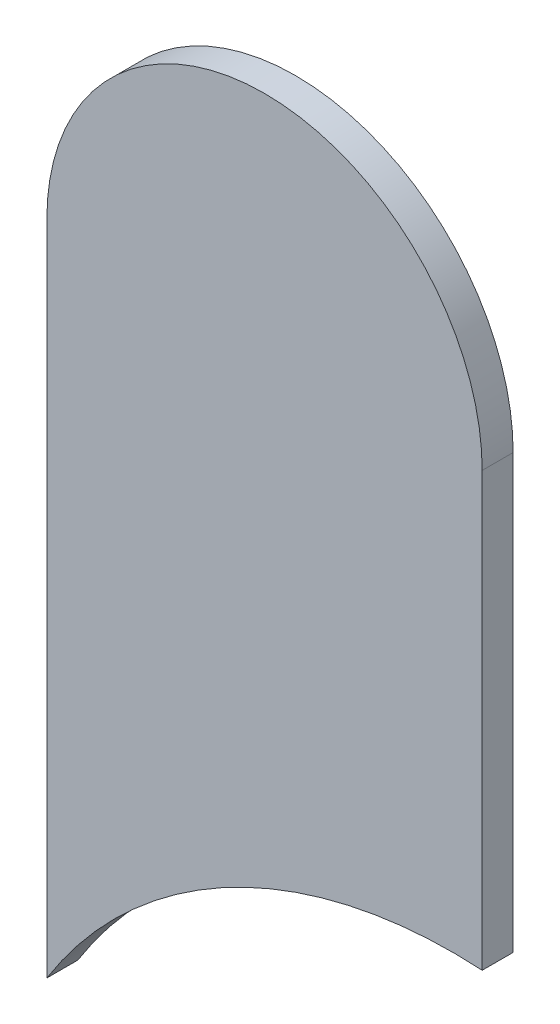
ISO-10303-21;
HEADER;
FILE_DESCRIPTION(('STEP AP214'),'2;1');
FILE_NAME('part.step','',(''),(''),'','','');
FILE_SCHEMA(('AUTOMOTIVE_DESIGN { 1 0 10303 214 1 1 1 1 }'));
ENDSEC;
DATA;
#1=APPLICATION_CONTEXT('core data for automotive mechanical design processes');
#2=APPLICATION_PROTOCOL_DEFINITION('international standard','automotive_design',2000,#1);
#3=PRODUCT_CONTEXT('',#1,'mechanical');
#4=PRODUCT('Part','Part','',(#3));
#5=PRODUCT_RELATED_PRODUCT_CATEGORY('part','',(#4));
#6=PRODUCT_DEFINITION_FORMATION('','',#4);
#7=PRODUCT_DEFINITION_CONTEXT('part definition',#1,'design');
#8=PRODUCT_DEFINITION('design','',#6,#7);
#9=PRODUCT_DEFINITION_SHAPE('','',#8);
#10=(LENGTH_UNIT() NAMED_UNIT(*) SI_UNIT(.MILLI.,.METRE.));
#11=(NAMED_UNIT(*) PLANE_ANGLE_UNIT() SI_UNIT($,.RADIAN.));
#12=(NAMED_UNIT(*) SI_UNIT($,.STERADIAN.) SOLID_ANGLE_UNIT());
#13=UNCERTAINTY_MEASURE_WITH_UNIT(LENGTH_MEASURE(1.E-05),#10,'distance_accuracy_value','');
#14=(GEOMETRIC_REPRESENTATION_CONTEXT(3) GLOBAL_UNCERTAINTY_ASSIGNED_CONTEXT((#13)) GLOBAL_UNIT_ASSIGNED_CONTEXT((#10,
#11,#12)) REPRESENTATION_CONTEXT('',''));
#15=CARTESIAN_POINT('',(0.,0.,0.));
#16=DIRECTION('',(0.,0.,1.));
#17=DIRECTION('',(1.,0.,0.));
#18=AXIS2_PLACEMENT_3D('',#15,#16,#17);
#19=CARTESIAN_POINT('',(78.9335099,66.7856251389162,0.));
#20=DIRECTION('',(-1.,0.,0.));
#21=DIRECTION('',(0.,1.,0.));
#22=AXIS2_PLACEMENT_3D('',#19,#20,#21);
#23=PLANE('',#22);
#24=DIRECTION('',(0.,1.,0.));
#25=VECTOR('',#24,1.);
#26=CARTESIAN_POINT('',(78.9335099,66.4532072,0.03556));
#27=LINE('',#26,#25);
#28=CARTESIAN_POINT('',(78.9335099,66.7856251389162,0.03556));
#29=VERTEX_POINT('',#28);
#30=CARTESIAN_POINT('',(78.9335099,67.2828728,0.03556));
#31=VERTEX_POINT('',#30);
#32=EDGE_CURVE('E11',#29,#31,#27,.T.);
#33=ORIENTED_EDGE('',*,*,#32,.F.);
#34=DIRECTION('',(0.,0.,1.));
#35=VECTOR('',#34,1.);
#36=CARTESIAN_POINT('',(78.9335099,66.7856251389162,0.));
#37=LINE('',#36,#35);
#38=CARTESIAN_POINT('',(78.9335099,66.7856251389162,0.));
#39=VERTEX_POINT('',#38);
#40=EDGE_CURVE('E24',#39,#29,#37,.T.);
#41=ORIENTED_EDGE('',*,*,#40,.F.);
#42=DIRECTION('',(0.,1.,0.));
#43=VECTOR('',#42,1.);
#44=CARTESIAN_POINT('',(78.9335099,66.4532072,0.));
#45=LINE('',#44,#43);
#46=CARTESIAN_POINT('',(78.9335099,67.2828728,0.));
#47=VERTEX_POINT('',#46);
#48=EDGE_CURVE('E75',#39,#47,#45,.T.);
#49=ORIENTED_EDGE('',*,*,#48,.T.);
#50=DIRECTION('',(0.,0.,1.));
#51=VECTOR('',#50,1.);
#52=CARTESIAN_POINT('',(78.9335099,67.2828728,0.));
#53=LINE('',#52,#51);
#54=EDGE_CURVE('E37',#47,#31,#53,.T.);
#55=ORIENTED_EDGE('',*,*,#54,.T.);
#56=EDGE_LOOP('',(#33,#41,#49,#55));
#57=FACE_BOUND('',#56,.T.);
#58=ADVANCED_FACE('F17',(#57),#23,.F.);
#59=CARTESIAN_POINT('',(78.6835104,67.2828728,0.));
#60=DIRECTION('',(0.,0.,-1.));
#61=DIRECTION('',(1.,0.,0.));
#62=AXIS2_PLACEMENT_3D('',#59,#60,#61);
#63=CYLINDRICAL_SURFACE('',#62,0.249999500000001);
#64=CARTESIAN_POINT('',(78.6835104,67.2828728,0.03556));
#65=DIRECTION('',(0.,0.,1.));
#66=DIRECTION('',(1.,0.,0.));
#67=AXIS2_PLACEMENT_3D('',#64,#65,#66);
#68=CIRCLE('',#67,0.249999500000001);
#69=CARTESIAN_POINT('',(78.4335109,67.2828728,0.03556));
#70=VERTEX_POINT('',#69);
#71=EDGE_CURVE('E83',#31,#70,#68,.T.);
#72=ORIENTED_EDGE('',*,*,#71,.F.);
#73=ORIENTED_EDGE('',*,*,#54,.F.);
#74=CARTESIAN_POINT('',(78.6835104,67.2828728,0.));
#75=DIRECTION('',(0.,0.,1.));
#76=DIRECTION('',(1.,0.,0.));
#77=AXIS2_PLACEMENT_3D('',#74,#75,#76);
#78=CIRCLE('',#77,0.249999500000001);
#79=CARTESIAN_POINT('',(78.4335109,67.2828728,0.));
#80=VERTEX_POINT('',#79);
#81=EDGE_CURVE('E81',#47,#80,#78,.T.);
#82=ORIENTED_EDGE('',*,*,#81,.T.);
#83=DIRECTION('',(0.,0.,1.));
#84=VECTOR('',#83,1.);
#85=CARTESIAN_POINT('',(78.4335109,67.2828728,0.));
#86=LINE('',#85,#84);
#87=EDGE_CURVE('E67',#80,#70,#86,.T.);
#88=ORIENTED_EDGE('',*,*,#87,.T.);
#89=EDGE_LOOP('',(#72,#73,#82,#88));
#90=FACE_BOUND('',#89,.T.);
#91=ADVANCED_FACE('F89',(#90),#63,.T.);
#92=CARTESIAN_POINT('',(78.4335109,67.2828728,0.));
#93=DIRECTION('',(1.,0.,0.));
#94=DIRECTION('',(0.,-1.,0.));
#95=AXIS2_PLACEMENT_3D('',#92,#93,#94);
#96=PLANE('',#95);
#97=DIRECTION('',(0.,-1.,0.));
#98=VECTOR('',#97,1.);
#99=CARTESIAN_POINT('',(78.4335109,67.2828728,0.03556));
#100=LINE('',#99,#98);
#101=CARTESIAN_POINT('',(78.4335109,66.5279680138146,0.03556));
#102=VERTEX_POINT('',#101);
#103=EDGE_CURVE('E71',#70,#102,#100,.T.);
#104=ORIENTED_EDGE('',*,*,#103,.F.);
#105=ORIENTED_EDGE('',*,*,#87,.F.);
#106=DIRECTION('',(0.,-1.,0.));
#107=VECTOR('',#106,1.);
#108=CARTESIAN_POINT('',(78.4335109,67.2828728,0.));
#109=LINE('',#108,#107);
#110=CARTESIAN_POINT('',(78.4335109,66.5279680138146,0.));
#111=VERTEX_POINT('',#110);
#112=EDGE_CURVE('E63',#80,#111,#109,.T.);
#113=ORIENTED_EDGE('',*,*,#112,.T.);
#114=DIRECTION('',(0.,0.,1.));
#115=VECTOR('',#114,1.);
#116=CARTESIAN_POINT('',(78.4335109,66.5279680138146,0.));
#117=LINE('',#116,#115);
#118=EDGE_CURVE('E53',#111,#102,#117,.T.);
#119=ORIENTED_EDGE('',*,*,#118,.T.);
#120=EDGE_LOOP('',(#104,#105,#113,#119));
#121=FACE_BOUND('',#120,.T.);
#122=ADVANCED_FACE('F66',(#121),#96,.F.);
#123=CARTESIAN_POINT('',(78.90002,66.2366468,0.));
#124=DIRECTION('',(0.,0.,-1.));
#125=DIRECTION('',(1.,0.,0.));
#126=AXIS2_PLACEMENT_3D('',#123,#124,#125);
#127=CYLINDRICAL_SURFACE('',#126,0.5499989);
#128=ORIENTED_EDGE('',*,*,#40,.T.);
#129=CARTESIAN_POINT('',(78.90002,66.2366468,0.03556));
#130=DIRECTION('',(0.,0.,1.));
#131=DIRECTION('',(1.,0.,0.));
#132=AXIS2_PLACEMENT_3D('',#129,#130,#131);
#133=CIRCLE('',#132,0.5499989);
#134=EDGE_CURVE('E59',#29,#102,#133,.T.);
#135=ORIENTED_EDGE('',*,*,#134,.T.);
#136=ORIENTED_EDGE('',*,*,#118,.F.);
#137=CARTESIAN_POINT('',(78.90002,66.2366468,0.));
#138=DIRECTION('',(0.,0.,1.));
#139=DIRECTION('',(1.,0.,0.));
#140=AXIS2_PLACEMENT_3D('',#137,#138,#139);
#141=CIRCLE('',#140,0.5499989);
#142=EDGE_CURVE('E57',#39,#111,#141,.T.);
#143=ORIENTED_EDGE('',*,*,#142,.F.);
#144=EDGE_LOOP('',(#128,#135,#136,#143));
#145=FACE_BOUND('',#144,.T.);
#146=ADVANCED_FACE('F55',(#145),#127,.F.);
#147=CARTESIAN_POINT('',(78.9335099,66.4532072,0.));
#148=DIRECTION('',(0.,0.,-1.));
#149=DIRECTION('',(-1.,0.,0.));
#150=AXIS2_PLACEMENT_3D('',#147,#148,#149);
#151=PLANE('',#150);
#152=ORIENTED_EDGE('',*,*,#48,.F.);
#153=ORIENTED_EDGE('',*,*,#142,.T.);
#154=ORIENTED_EDGE('',*,*,#112,.F.);
#155=ORIENTED_EDGE('',*,*,#81,.F.);
#156=EDGE_LOOP('',(#152,#153,#154,#155));
#157=FACE_BOUND('',#156,.T.);
#158=ADVANCED_FACE('F74',(#157),#151,.T.);
#159=CARTESIAN_POINT('',(78.9335099,66.4532072,0.03556));
#160=DIRECTION('',(0.,0.,-1.));
#161=DIRECTION('',(-1.,0.,0.));
#162=AXIS2_PLACEMENT_3D('',#159,#160,#161);
#163=PLANE('',#162);
#164=ORIENTED_EDGE('',*,*,#134,.F.);
#165=ORIENTED_EDGE('',*,*,#32,.T.);
#166=ORIENTED_EDGE('',*,*,#71,.T.);
#167=ORIENTED_EDGE('',*,*,#103,.T.);
#168=EDGE_LOOP('',(#164,#165,#166,#167));
#169=FACE_BOUND('',#168,.T.);
#170=ADVANCED_FACE('F91',(#169),#163,.F.);
#171=CLOSED_SHELL('',(#58,#91,#122,#146,#158,#170));
#172=MANIFOLD_SOLID_BREP('B1',#171);
#173=ADVANCED_BREP_SHAPE_REPRESENTATION('',(#18,#172),#14);
#174=SHAPE_DEFINITION_REPRESENTATION(#9,#173);
ENDSEC;
END-ISO-10303-21;
